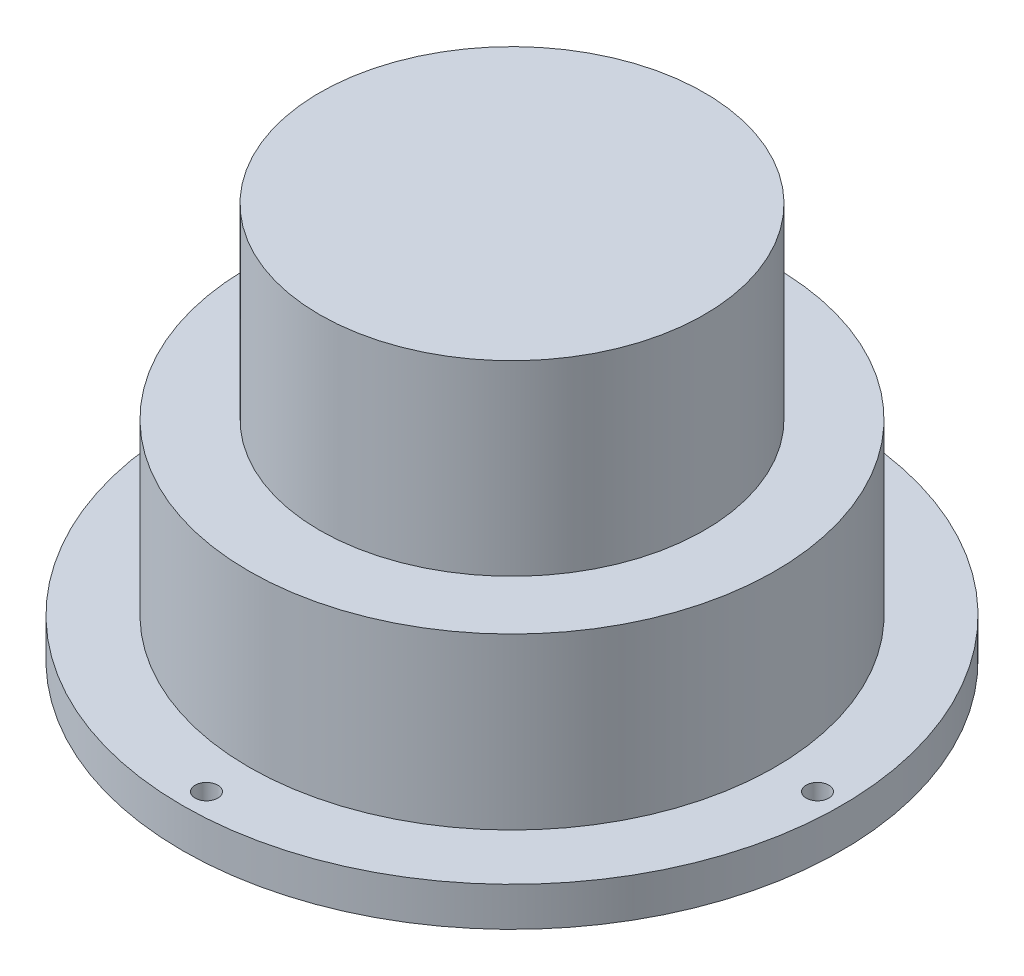
ISO-10303-21;
HEADER;
FILE_DESCRIPTION(('STEP AP214'),'2;1');
FILE_NAME('part.step','',(''),(''),'','','');
FILE_SCHEMA(('AUTOMOTIVE_DESIGN { 1 0 10303 214 1 1 1 1 }'));
ENDSEC;
DATA;
#1=APPLICATION_CONTEXT('core data for automotive mechanical design processes');
#2=APPLICATION_PROTOCOL_DEFINITION('international standard','automotive_design',2000,#1);
#3=PRODUCT_CONTEXT('',#1,'mechanical');
#4=PRODUCT('Part','Part','',(#3));
#5=PRODUCT_RELATED_PRODUCT_CATEGORY('part','',(#4));
#6=PRODUCT_DEFINITION_FORMATION('','',#4);
#7=PRODUCT_DEFINITION_CONTEXT('part definition',#1,'design');
#8=PRODUCT_DEFINITION('design','',#6,#7);
#9=PRODUCT_DEFINITION_SHAPE('','',#8);
#10=(LENGTH_UNIT() NAMED_UNIT(*) SI_UNIT(.MILLI.,.METRE.));
#11=(NAMED_UNIT(*) PLANE_ANGLE_UNIT() SI_UNIT($,.RADIAN.));
#12=(NAMED_UNIT(*) SI_UNIT($,.STERADIAN.) SOLID_ANGLE_UNIT());
#13=UNCERTAINTY_MEASURE_WITH_UNIT(LENGTH_MEASURE(1.E-05),#10,'distance_accuracy_value','');
#14=(GEOMETRIC_REPRESENTATION_CONTEXT(3) GLOBAL_UNCERTAINTY_ASSIGNED_CONTEXT((#13)) GLOBAL_UNIT_ASSIGNED_CONTEXT((#10,
#11,#12)) REPRESENTATION_CONTEXT('',''));
#15=CARTESIAN_POINT('',(0.,0.,0.));
#16=DIRECTION('',(0.,0.,1.));
#17=DIRECTION('',(1.,0.,0.));
#18=AXIS2_PLACEMENT_3D('',#15,#16,#17);
#19=CARTESIAN_POINT('',(0.,6.9,0.));
#20=DIRECTION('',(0.,-1.,0.));
#21=DIRECTION('',(0.,0.,-1.));
#22=AXIS2_PLACEMENT_3D('',#19,#20,#21);
#23=CYLINDRICAL_SURFACE('',#22,58.25);
#24=CARTESIAN_POINT('',(0.,6.9,0.));
#25=DIRECTION('',(0.,1.,0.));
#26=DIRECTION('',(0.,0.,1.));
#27=AXIS2_PLACEMENT_3D('',#24,#25,#26);
#28=CIRCLE('',#27,58.25);
#29=CARTESIAN_POINT('',(0.,6.9,-58.25));
#30=VERTEX_POINT('',#29);
#31=EDGE_CURVE('E10',#30,#30,#28,.T.);
#32=CARTESIAN_POINT('',(0.,0.,0.));
#33=DIRECTION('',(0.,1.,0.));
#34=DIRECTION('',(0.,0.,1.));
#35=AXIS2_PLACEMENT_3D('',#32,#33,#34);
#36=CIRCLE('',#35,58.25);
#37=CARTESIAN_POINT('',(0.,0.,-58.25));
#38=VERTEX_POINT('',#37);
#39=EDGE_CURVE('E34',#38,#38,#36,.T.);
#40=CARTESIAN_POINT('',(0.,6.9,-58.25));
#41=CARTESIAN_POINT('',(0.,6.828125,-58.25));
#42=CARTESIAN_POINT('',(0.,6.75625,-58.25));
#43=CARTESIAN_POINT('',(0.,6.6125,-58.25));
#44=CARTESIAN_POINT('',(0.,6.540625,-58.25));
#45=CARTESIAN_POINT('',(0.,6.396875,-58.25));
#46=CARTESIAN_POINT('',(0.,6.325,-58.25));
#47=CARTESIAN_POINT('',(0.,6.18125,-58.25));
#48=CARTESIAN_POINT('',(0.,6.109375,-58.25));
#49=CARTESIAN_POINT('',(0.,5.965625,-58.25));
#50=CARTESIAN_POINT('',(0.,5.89375,-58.25));
#51=CARTESIAN_POINT('',(0.,5.75,-58.25));
#52=CARTESIAN_POINT('',(0.,5.678125,-58.25));
#53=CARTESIAN_POINT('',(0.,5.534375,-58.25));
#54=CARTESIAN_POINT('',(0.,5.4625,-58.25));
#55=CARTESIAN_POINT('',(0.,5.31875,-58.25));
#56=CARTESIAN_POINT('',(0.,5.246875,-58.25));
#57=CARTESIAN_POINT('',(0.,5.103125,-58.25));
#58=CARTESIAN_POINT('',(0.,5.03125,-58.25));
#59=CARTESIAN_POINT('',(0.,4.8875,-58.25));
#60=CARTESIAN_POINT('',(0.,4.815625,-58.25));
#61=CARTESIAN_POINT('',(0.,4.671875,-58.25));
#62=CARTESIAN_POINT('',(0.,4.6,-58.25));
#63=CARTESIAN_POINT('',(0.,4.45625,-58.25));
#64=CARTESIAN_POINT('',(0.,4.384375,-58.25));
#65=CARTESIAN_POINT('',(0.,4.240625,-58.25));
#66=CARTESIAN_POINT('',(0.,4.16875,-58.25));
#67=CARTESIAN_POINT('',(0.,4.025,-58.25));
#68=CARTESIAN_POINT('',(0.,3.953125,-58.25));
#69=CARTESIAN_POINT('',(0.,3.809375,-58.25));
#70=CARTESIAN_POINT('',(0.,3.7375,-58.25));
#71=CARTESIAN_POINT('',(0.,3.59375,-58.25));
#72=CARTESIAN_POINT('',(0.,3.521875,-58.25));
#73=CARTESIAN_POINT('',(0.,3.378125,-58.25));
#74=CARTESIAN_POINT('',(0.,3.30625,-58.25));
#75=CARTESIAN_POINT('',(0.,3.1625,-58.25));
#76=CARTESIAN_POINT('',(0.,3.090625,-58.25));
#77=CARTESIAN_POINT('',(0.,2.946875,-58.25));
#78=CARTESIAN_POINT('',(0.,2.875,-58.25));
#79=CARTESIAN_POINT('',(0.,2.73125,-58.25));
#80=CARTESIAN_POINT('',(0.,2.659375,-58.25));
#81=CARTESIAN_POINT('',(0.,2.515625,-58.25));
#82=CARTESIAN_POINT('',(0.,2.44375,-58.25));
#83=CARTESIAN_POINT('',(0.,2.3,-58.25));
#84=CARTESIAN_POINT('',(0.,2.228125,-58.25));
#85=CARTESIAN_POINT('',(0.,2.084375,-58.25));
#86=CARTESIAN_POINT('',(0.,2.0125,-58.25));
#87=CARTESIAN_POINT('',(0.,1.86875,-58.25));
#88=CARTESIAN_POINT('',(0.,1.796875,-58.25));
#89=CARTESIAN_POINT('',(0.,1.653125,-58.25));
#90=CARTESIAN_POINT('',(0.,1.58125,-58.25));
#91=CARTESIAN_POINT('',(0.,1.4375,-58.25));
#92=CARTESIAN_POINT('',(0.,1.365625,-58.25));
#93=CARTESIAN_POINT('',(0.,1.221875,-58.25));
#94=CARTESIAN_POINT('',(0.,1.15,-58.25));
#95=CARTESIAN_POINT('',(0.,1.00625,-58.25));
#96=CARTESIAN_POINT('',(0.,0.934375,-58.25));
#97=CARTESIAN_POINT('',(0.,0.790625,-58.25));
#98=CARTESIAN_POINT('',(0.,0.71875,-58.25));
#99=CARTESIAN_POINT('',(0.,0.575,-58.25));
#100=CARTESIAN_POINT('',(0.,0.503125,-58.25));
#101=CARTESIAN_POINT('',(0.,0.359375,-58.25));
#102=CARTESIAN_POINT('',(0.,0.2875,-58.25));
#103=CARTESIAN_POINT('',(0.,0.14375,-58.25));
#104=CARTESIAN_POINT('',(0.,0.0718749999999998,-58.25));
#105=CARTESIAN_POINT('',(0.,0.,-58.25));
#106=B_SPLINE_CURVE_WITH_KNOTS('',3,(#40,#41,#42,#43,#44,#45,#46,#47,#48,#49,#50,#51,#52,#53,
#54,#55,#56,#57,#58,#59,#60,#61,#62,#63,#64,#65,#66,#67,#68,#69,#70,#71,#72,#73,#74,#75,#76,#77,
#78,#79,#80,#81,#82,#83,#84,#85,#86,#87,#88,#89,#90,#91,#92,#93,#94,#95,#96,#97,#98,#99,#100,
#101,#102,#103,#104,#105),.UNSPECIFIED.,.F.,.F.,(4,2,2,2,2,2,2,2,2,2,2,2,2,2,2,2,2,2,2,2,2,2,2,
2,2,2,2,2,2,2,2,2,4),(0.,0.215625000000001,0.43125,0.646875000000001,0.8625,1.078125,1.29375,
1.509375,1.725,1.940625,2.15625,2.371875,2.5875,2.803125,3.01875,3.234375,3.45,3.665625,3.88125,
4.096875,4.3125,4.528125,4.74375,4.959375,5.175,5.390625,5.60625,5.821875,6.0375,6.253125,
6.46875,6.684375,6.9),.UNSPECIFIED.);
#107=EDGE_CURVE('BSEAM31',#30,#38,#106,.T.);
#108=ORIENTED_EDGE('',*,*,#31,.F.);
#109=ORIENTED_EDGE('',*,*,#39,.T.);
#110=ORIENTED_EDGE('',*,*,#107,.T.);
#111=ORIENTED_EDGE('',*,*,#107,.F.);
#112=EDGE_LOOP('',(#108,#110,#109,#111));
#113=FACE_BOUND('',#112,.T.);
#114=ADVANCED_FACE('F31',(#113),#23,.T.);
#115=CARTESIAN_POINT('',(0.,6.9,0.));
#116=DIRECTION('',(0.,1.,0.));
#117=DIRECTION('',(0.,0.,1.));
#118=AXIS2_PLACEMENT_3D('',#115,#116,#117);
#119=PLANE('',#118);
#120=CARTESIAN_POINT('',(0.,6.9,0.));
#121=DIRECTION('',(0.,1.,0.));
#122=DIRECTION('',(0.,0.,1.));
#123=AXIS2_PLACEMENT_3D('',#120,#121,#122);
#124=CIRCLE('',#123,46.5);
#125=CARTESIAN_POINT('',(0.,6.9,46.5));
#126=VERTEX_POINT('',#125);
#127=EDGE_CURVE('E67',#126,#126,#124,.T.);
#128=ORIENTED_EDGE('',*,*,#127,.F.);
#129=EDGE_LOOP('',(#128));
#130=FACE_BOUND('',#129,.T.);
#131=CARTESIAN_POINT('',(0.,6.9,-54.));
#132=DIRECTION('',(0.,1.,0.));
#133=DIRECTION('',(0.,0.,1.));
#134=AXIS2_PLACEMENT_3D('',#131,#132,#133);
#135=CIRCLE('',#134,2.);
#136=CARTESIAN_POINT('',(0.,6.9,-52.));
#137=VERTEX_POINT('',#136);
#138=EDGE_CURVE('E62',#137,#137,#135,.T.);
#139=ORIENTED_EDGE('',*,*,#138,.F.);
#140=EDGE_LOOP('',(#139));
#141=FACE_BOUND('',#140,.T.);
#142=CARTESIAN_POINT('',(54.,6.9,0.));
#143=DIRECTION('',(0.,1.,0.));
#144=DIRECTION('',(0.,0.,1.));
#145=AXIS2_PLACEMENT_3D('',#142,#143,#144);
#146=CIRCLE('',#145,2.);
#147=CARTESIAN_POINT('',(54.,6.9,2.));
#148=VERTEX_POINT('',#147);
#149=EDGE_CURVE('E56',#148,#148,#146,.T.);
#150=ORIENTED_EDGE('',*,*,#149,.F.);
#151=EDGE_LOOP('',(#150));
#152=FACE_BOUND('',#151,.T.);
#153=CARTESIAN_POINT('',(0.,6.9,54.));
#154=DIRECTION('',(0.,1.,0.));
#155=DIRECTION('',(0.,0.,1.));
#156=AXIS2_PLACEMENT_3D('',#153,#154,#155);
#157=CIRCLE('',#156,2.);
#158=CARTESIAN_POINT('',(0.,6.9,56.));
#159=VERTEX_POINT('',#158);
#160=EDGE_CURVE('E49',#159,#159,#157,.T.);
#161=ORIENTED_EDGE('',*,*,#160,.F.);
#162=EDGE_LOOP('',(#161));
#163=FACE_BOUND('',#162,.T.);
#164=CARTESIAN_POINT('',(-54.,6.9,0.));
#165=DIRECTION('',(0.,1.,0.));
#166=DIRECTION('',(0.,0.,1.));
#167=AXIS2_PLACEMENT_3D('',#164,#165,#166);
#168=CIRCLE('',#167,2.);
#169=CARTESIAN_POINT('',(-54.,6.9,2.));
#170=VERTEX_POINT('',#169);
#171=EDGE_CURVE('E43',#170,#170,#168,.T.);
#172=ORIENTED_EDGE('',*,*,#171,.F.);
#173=EDGE_LOOP('',(#172));
#174=FACE_BOUND('',#173,.T.);
#175=ORIENTED_EDGE('',*,*,#31,.T.);
#176=EDGE_LOOP('',(#175));
#177=FACE_BOUND('',#176,.T.);
#178=ADVANCED_FACE('F100',(#130,#141,#152,#163,#174,#177),#119,.T.);
#179=CARTESIAN_POINT('',(0.,0.,0.));
#180=DIRECTION('',(0.,1.,0.));
#181=DIRECTION('',(0.,0.,1.));
#182=AXIS2_PLACEMENT_3D('',#179,#180,#181);
#183=PLANE('',#182);
#184=CARTESIAN_POINT('',(0.,0.,-54.));
#185=DIRECTION('',(0.,1.,0.));
#186=DIRECTION('',(0.,0.,1.));
#187=AXIS2_PLACEMENT_3D('',#184,#185,#186);
#188=CIRCLE('',#187,2.);
#189=CARTESIAN_POINT('',(0.,0.,-52.));
#190=VERTEX_POINT('',#189);
#191=EDGE_CURVE('E46',#190,#190,#188,.T.);
#192=ORIENTED_EDGE('',*,*,#191,.T.);
#193=EDGE_LOOP('',(#192));
#194=FACE_BOUND('',#193,.T.);
#195=CARTESIAN_POINT('',(54.,0.,0.));
#196=DIRECTION('',(0.,1.,0.));
#197=DIRECTION('',(0.,0.,1.));
#198=AXIS2_PLACEMENT_3D('',#195,#196,#197);
#199=CIRCLE('',#198,2.);
#200=CARTESIAN_POINT('',(54.,0.,2.));
#201=VERTEX_POINT('',#200);
#202=EDGE_CURVE('E59',#201,#201,#199,.T.);
#203=ORIENTED_EDGE('',*,*,#202,.T.);
#204=EDGE_LOOP('',(#203));
#205=FACE_BOUND('',#204,.T.);
#206=CARTESIAN_POINT('',(0.,0.,54.));
#207=DIRECTION('',(0.,1.,0.));
#208=DIRECTION('',(0.,0.,1.));
#209=AXIS2_PLACEMENT_3D('',#206,#207,#208);
#210=CIRCLE('',#209,2.);
#211=CARTESIAN_POINT('',(0.,0.,56.));
#212=VERTEX_POINT('',#211);
#213=EDGE_CURVE('E52',#212,#212,#210,.T.);
#214=ORIENTED_EDGE('',*,*,#213,.T.);
#215=EDGE_LOOP('',(#214));
#216=FACE_BOUND('',#215,.T.);
#217=CARTESIAN_POINT('',(-54.,0.,0.));
#218=DIRECTION('',(0.,1.,0.));
#219=DIRECTION('',(0.,0.,1.));
#220=AXIS2_PLACEMENT_3D('',#217,#218,#219);
#221=CIRCLE('',#220,2.);
#222=CARTESIAN_POINT('',(-54.,0.,2.));
#223=VERTEX_POINT('',#222);
#224=EDGE_CURVE('E41',#223,#223,#221,.T.);
#225=ORIENTED_EDGE('',*,*,#224,.T.);
#226=EDGE_LOOP('',(#225));
#227=FACE_BOUND('',#226,.T.);
#228=ORIENTED_EDGE('',*,*,#39,.F.);
#229=EDGE_LOOP('',(#228));
#230=FACE_BOUND('',#229,.T.);
#231=ADVANCED_FACE('F103',(#194,#205,#216,#227,#230),#183,.F.);
#232=CARTESIAN_POINT('',(-54.,0.,0.));
#233=DIRECTION('',(0.,1.,0.));
#234=DIRECTION('',(0.,0.,1.));
#235=AXIS2_PLACEMENT_3D('',#232,#233,#234);
#236=CYLINDRICAL_SURFACE('',#235,2.);
#237=CARTESIAN_POINT('',(-54.,0.,2.));
#238=CARTESIAN_POINT('',(-54.,0.071875,2.));
#239=CARTESIAN_POINT('',(-54.,0.14375,2.));
#240=CARTESIAN_POINT('',(-54.,0.2875,2.));
#241=CARTESIAN_POINT('',(-54.,0.359375,2.));
#242=CARTESIAN_POINT('',(-54.,0.503125,2.));
#243=CARTESIAN_POINT('',(-54.,0.575,2.));
#244=CARTESIAN_POINT('',(-54.,0.71875,2.));
#245=CARTESIAN_POINT('',(-54.,0.790625,2.));
#246=CARTESIAN_POINT('',(-54.,0.934375,2.));
#247=CARTESIAN_POINT('',(-54.,1.00625,2.));
#248=CARTESIAN_POINT('',(-54.,1.15,2.));
#249=CARTESIAN_POINT('',(-54.,1.221875,2.));
#250=CARTESIAN_POINT('',(-54.,1.365625,2.));
#251=CARTESIAN_POINT('',(-54.,1.4375,2.));
#252=CARTESIAN_POINT('',(-54.,1.58125,2.));
#253=CARTESIAN_POINT('',(-54.,1.653125,2.));
#254=CARTESIAN_POINT('',(-54.,1.796875,2.));
#255=CARTESIAN_POINT('',(-54.,1.86875,2.));
#256=CARTESIAN_POINT('',(-54.,2.0125,2.));
#257=CARTESIAN_POINT('',(-54.,2.084375,2.));
#258=CARTESIAN_POINT('',(-54.,2.228125,2.));
#259=CARTESIAN_POINT('',(-54.,2.3,2.));
#260=CARTESIAN_POINT('',(-54.,2.44375,2.));
#261=CARTESIAN_POINT('',(-54.,2.515625,2.));
#262=CARTESIAN_POINT('',(-54.,2.659375,2.));
#263=CARTESIAN_POINT('',(-54.,2.73125,2.));
#264=CARTESIAN_POINT('',(-54.,2.875,2.));
#265=CARTESIAN_POINT('',(-54.,2.946875,2.));
#266=CARTESIAN_POINT('',(-54.,3.090625,2.));
#267=CARTESIAN_POINT('',(-54.,3.1625,2.));
#268=CARTESIAN_POINT('',(-54.,3.30625,2.));
#269=CARTESIAN_POINT('',(-54.,3.378125,2.));
#270=CARTESIAN_POINT('',(-54.,3.521875,2.));
#271=CARTESIAN_POINT('',(-54.,3.59375,2.));
#272=CARTESIAN_POINT('',(-54.,3.7375,2.));
#273=CARTESIAN_POINT('',(-54.,3.809375,2.));
#274=CARTESIAN_POINT('',(-54.,3.953125,2.));
#275=CARTESIAN_POINT('',(-54.,4.025,2.));
#276=CARTESIAN_POINT('',(-54.,4.16875,2.));
#277=CARTESIAN_POINT('',(-54.,4.240625,2.));
#278=CARTESIAN_POINT('',(-54.,4.384375,2.));
#279=CARTESIAN_POINT('',(-54.,4.45625,2.));
#280=CARTESIAN_POINT('',(-54.,4.6,2.));
#281=CARTESIAN_POINT('',(-54.,4.671875,2.));
#282=CARTESIAN_POINT('',(-54.,4.815625,2.));
#283=CARTESIAN_POINT('',(-54.,4.8875,2.));
#284=CARTESIAN_POINT('',(-54.,5.03125,2.));
#285=CARTESIAN_POINT('',(-54.,5.103125,2.));
#286=CARTESIAN_POINT('',(-54.,5.246875,2.));
#287=CARTESIAN_POINT('',(-54.,5.31875,2.));
#288=CARTESIAN_POINT('',(-54.,5.4625,2.));
#289=CARTESIAN_POINT('',(-54.,5.534375,2.));
#290=CARTESIAN_POINT('',(-54.,5.678125,2.));
#291=CARTESIAN_POINT('',(-54.,5.75,2.));
#292=CARTESIAN_POINT('',(-54.,5.89375,2.));
#293=CARTESIAN_POINT('',(-54.,5.965625,2.));
#294=CARTESIAN_POINT('',(-54.,6.109375,2.));
#295=CARTESIAN_POINT('',(-54.,6.18125,2.));
#296=CARTESIAN_POINT('',(-54.,6.325,2.));
#297=CARTESIAN_POINT('',(-54.,6.396875,2.));
#298=CARTESIAN_POINT('',(-54.,6.540625,2.));
#299=CARTESIAN_POINT('',(-54.,6.6125,2.));
#300=CARTESIAN_POINT('',(-54.,6.75625,2.));
#301=CARTESIAN_POINT('',(-54.,6.828125,2.));
#302=CARTESIAN_POINT('',(-54.,6.9,2.));
#303=B_SPLINE_CURVE_WITH_KNOTS('',3,(#237,#238,#239,#240,#241,#242,#243,#244,#245,#246,#247,
#248,#249,#250,#251,#252,#253,#254,#255,#256,#257,#258,#259,#260,#261,#262,#263,#264,#265,#266,
#267,#268,#269,#270,#271,#272,#273,#274,#275,#276,#277,#278,#279,#280,#281,#282,#283,#284,#285,
#286,#287,#288,#289,#290,#291,#292,#293,#294,#295,#296,#297,#298,#299,#300,#301,#302),
.UNSPECIFIED.,.F.,.F.,(4,2,2,2,2,2,2,2,2,2,2,2,2,2,2,2,2,2,2,2,2,2,2,2,2,2,2,2,2,2,2,2,4),(0.,
0.215625,0.43125,0.646875,0.8625,1.078125,1.29375,1.509375,1.725,1.940625,2.15625,2.371875,
2.5875,2.803125,3.01875,3.234375,3.45,3.665625,3.88125,4.096875,4.3125,4.528125,4.74375,
4.959375,5.175,5.390625,5.60625,5.821875,6.0375,6.253125,6.46875,6.684375,6.9),.UNSPECIFIED.);
#304=EDGE_CURVE('BSEAM113',#223,#170,#303,.T.);
#305=ORIENTED_EDGE('',*,*,#224,.F.);
#306=ORIENTED_EDGE('',*,*,#171,.T.);
#307=ORIENTED_EDGE('',*,*,#304,.T.);
#308=ORIENTED_EDGE('',*,*,#304,.F.);
#309=EDGE_LOOP('',(#305,#307,#306,#308));
#310=FACE_BOUND('',#309,.T.);
#311=ADVANCED_FACE('F113',(#310),#236,.F.);
#312=CARTESIAN_POINT('',(0.,0.,54.));
#313=DIRECTION('',(0.,1.,0.));
#314=DIRECTION('',(0.,0.,1.));
#315=AXIS2_PLACEMENT_3D('',#312,#313,#314);
#316=CYLINDRICAL_SURFACE('',#315,2.);
#317=CARTESIAN_POINT('',(0.,0.,56.));
#318=CARTESIAN_POINT('',(0.,0.071875,56.));
#319=CARTESIAN_POINT('',(0.,0.14375,56.));
#320=CARTESIAN_POINT('',(0.,0.2875,56.));
#321=CARTESIAN_POINT('',(0.,0.359375,56.));
#322=CARTESIAN_POINT('',(0.,0.503125,56.));
#323=CARTESIAN_POINT('',(0.,0.575,56.));
#324=CARTESIAN_POINT('',(0.,0.71875,56.));
#325=CARTESIAN_POINT('',(0.,0.790625,56.));
#326=CARTESIAN_POINT('',(0.,0.934375,56.));
#327=CARTESIAN_POINT('',(0.,1.00625,56.));
#328=CARTESIAN_POINT('',(0.,1.15,56.));
#329=CARTESIAN_POINT('',(0.,1.221875,56.));
#330=CARTESIAN_POINT('',(0.,1.365625,56.));
#331=CARTESIAN_POINT('',(0.,1.4375,56.));
#332=CARTESIAN_POINT('',(0.,1.58125,56.));
#333=CARTESIAN_POINT('',(0.,1.653125,56.));
#334=CARTESIAN_POINT('',(0.,1.796875,56.));
#335=CARTESIAN_POINT('',(0.,1.86875,56.));
#336=CARTESIAN_POINT('',(0.,2.0125,56.));
#337=CARTESIAN_POINT('',(0.,2.084375,56.));
#338=CARTESIAN_POINT('',(0.,2.228125,56.));
#339=CARTESIAN_POINT('',(0.,2.3,56.));
#340=CARTESIAN_POINT('',(0.,2.44375,56.));
#341=CARTESIAN_POINT('',(0.,2.515625,56.));
#342=CARTESIAN_POINT('',(0.,2.659375,56.));
#343=CARTESIAN_POINT('',(0.,2.73125,56.));
#344=CARTESIAN_POINT('',(0.,2.875,56.));
#345=CARTESIAN_POINT('',(0.,2.946875,56.));
#346=CARTESIAN_POINT('',(0.,3.090625,56.));
#347=CARTESIAN_POINT('',(0.,3.1625,56.));
#348=CARTESIAN_POINT('',(0.,3.30625,56.));
#349=CARTESIAN_POINT('',(0.,3.378125,56.));
#350=CARTESIAN_POINT('',(0.,3.521875,56.));
#351=CARTESIAN_POINT('',(0.,3.59375,56.));
#352=CARTESIAN_POINT('',(0.,3.7375,56.));
#353=CARTESIAN_POINT('',(0.,3.809375,56.));
#354=CARTESIAN_POINT('',(0.,3.953125,56.));
#355=CARTESIAN_POINT('',(0.,4.025,56.));
#356=CARTESIAN_POINT('',(0.,4.16875,56.));
#357=CARTESIAN_POINT('',(0.,4.240625,56.));
#358=CARTESIAN_POINT('',(0.,4.384375,56.));
#359=CARTESIAN_POINT('',(0.,4.45625,56.));
#360=CARTESIAN_POINT('',(0.,4.6,56.));
#361=CARTESIAN_POINT('',(0.,4.671875,56.));
#362=CARTESIAN_POINT('',(0.,4.815625,56.));
#363=CARTESIAN_POINT('',(0.,4.8875,56.));
#364=CARTESIAN_POINT('',(0.,5.03125,56.));
#365=CARTESIAN_POINT('',(0.,5.103125,56.));
#366=CARTESIAN_POINT('',(0.,5.246875,56.));
#367=CARTESIAN_POINT('',(0.,5.31875,56.));
#368=CARTESIAN_POINT('',(0.,5.4625,56.));
#369=CARTESIAN_POINT('',(0.,5.534375,56.));
#370=CARTESIAN_POINT('',(0.,5.678125,56.));
#371=CARTESIAN_POINT('',(0.,5.75,56.));
#372=CARTESIAN_POINT('',(0.,5.89375,56.));
#373=CARTESIAN_POINT('',(0.,5.965625,56.));
#374=CARTESIAN_POINT('',(0.,6.109375,56.));
#375=CARTESIAN_POINT('',(0.,6.18125,56.));
#376=CARTESIAN_POINT('',(0.,6.325,56.));
#377=CARTESIAN_POINT('',(0.,6.396875,56.));
#378=CARTESIAN_POINT('',(0.,6.540625,56.));
#379=CARTESIAN_POINT('',(0.,6.6125,56.));
#380=CARTESIAN_POINT('',(0.,6.75625,56.));
#381=CARTESIAN_POINT('',(0.,6.828125,56.));
#382=CARTESIAN_POINT('',(0.,6.9,56.));
#383=B_SPLINE_CURVE_WITH_KNOTS('',3,(#317,#318,#319,#320,#321,#322,#323,#324,#325,#326,#327,
#328,#329,#330,#331,#332,#333,#334,#335,#336,#337,#338,#339,#340,#341,#342,#343,#344,#345,#346,
#347,#348,#349,#350,#351,#352,#353,#354,#355,#356,#357,#358,#359,#360,#361,#362,#363,#364,#365,
#366,#367,#368,#369,#370,#371,#372,#373,#374,#375,#376,#377,#378,#379,#380,#381,#382),
.UNSPECIFIED.,.F.,.F.,(4,2,2,2,2,2,2,2,2,2,2,2,2,2,2,2,2,2,2,2,2,2,2,2,2,2,2,2,2,2,2,2,4),(0.,
0.215625,0.43125,0.646875,0.8625,1.078125,1.29375,1.509375,1.725,1.940625,2.15625,2.371875,
2.5875,2.803125,3.01875,3.234375,3.45,3.665625,3.88125,4.096875,4.3125,4.528125,4.74375,
4.959375,5.175,5.390625,5.60625,5.821875,6.0375,6.253125,6.46875,6.684375,6.9),.UNSPECIFIED.);
#384=EDGE_CURVE('BSEAM115',#212,#159,#383,.T.);
#385=ORIENTED_EDGE('',*,*,#213,.F.);
#386=ORIENTED_EDGE('',*,*,#160,.T.);
#387=ORIENTED_EDGE('',*,*,#384,.T.);
#388=ORIENTED_EDGE('',*,*,#384,.F.);
#389=EDGE_LOOP('',(#385,#387,#386,#388));
#390=FACE_BOUND('',#389,.T.);
#391=ADVANCED_FACE('F115',(#390),#316,.F.);
#392=CARTESIAN_POINT('',(54.,0.,0.));
#393=DIRECTION('',(0.,1.,0.));
#394=DIRECTION('',(0.,0.,1.));
#395=AXIS2_PLACEMENT_3D('',#392,#393,#394);
#396=CYLINDRICAL_SURFACE('',#395,2.);
#397=CARTESIAN_POINT('',(54.,0.,2.));
#398=CARTESIAN_POINT('',(54.,0.071875,2.));
#399=CARTESIAN_POINT('',(54.,0.14375,2.));
#400=CARTESIAN_POINT('',(54.,0.2875,2.));
#401=CARTESIAN_POINT('',(54.,0.359375,2.));
#402=CARTESIAN_POINT('',(54.,0.503125,2.));
#403=CARTESIAN_POINT('',(54.,0.575,2.));
#404=CARTESIAN_POINT('',(54.,0.71875,2.));
#405=CARTESIAN_POINT('',(54.,0.790625,2.));
#406=CARTESIAN_POINT('',(54.,0.934375,2.));
#407=CARTESIAN_POINT('',(54.,1.00625,2.));
#408=CARTESIAN_POINT('',(54.,1.15,2.));
#409=CARTESIAN_POINT('',(54.,1.221875,2.));
#410=CARTESIAN_POINT('',(54.,1.365625,2.));
#411=CARTESIAN_POINT('',(54.,1.4375,2.));
#412=CARTESIAN_POINT('',(54.,1.58125,2.));
#413=CARTESIAN_POINT('',(54.,1.653125,2.));
#414=CARTESIAN_POINT('',(54.,1.796875,2.));
#415=CARTESIAN_POINT('',(54.,1.86875,2.));
#416=CARTESIAN_POINT('',(54.,2.0125,2.));
#417=CARTESIAN_POINT('',(54.,2.084375,2.));
#418=CARTESIAN_POINT('',(54.,2.228125,2.));
#419=CARTESIAN_POINT('',(54.,2.3,2.));
#420=CARTESIAN_POINT('',(54.,2.44375,2.));
#421=CARTESIAN_POINT('',(54.,2.515625,2.));
#422=CARTESIAN_POINT('',(54.,2.659375,2.));
#423=CARTESIAN_POINT('',(54.,2.73125,2.));
#424=CARTESIAN_POINT('',(54.,2.875,2.));
#425=CARTESIAN_POINT('',(54.,2.946875,2.));
#426=CARTESIAN_POINT('',(54.,3.090625,2.));
#427=CARTESIAN_POINT('',(54.,3.1625,2.));
#428=CARTESIAN_POINT('',(54.,3.30625,2.));
#429=CARTESIAN_POINT('',(54.,3.378125,2.));
#430=CARTESIAN_POINT('',(54.,3.521875,2.));
#431=CARTESIAN_POINT('',(54.,3.59375,2.));
#432=CARTESIAN_POINT('',(54.,3.7375,2.));
#433=CARTESIAN_POINT('',(54.,3.809375,2.));
#434=CARTESIAN_POINT('',(54.,3.953125,2.));
#435=CARTESIAN_POINT('',(54.,4.025,2.));
#436=CARTESIAN_POINT('',(54.,4.16875,2.));
#437=CARTESIAN_POINT('',(54.,4.240625,2.));
#438=CARTESIAN_POINT('',(54.,4.384375,2.));
#439=CARTESIAN_POINT('',(54.,4.45625,2.));
#440=CARTESIAN_POINT('',(54.,4.6,2.));
#441=CARTESIAN_POINT('',(54.,4.671875,2.));
#442=CARTESIAN_POINT('',(54.,4.815625,2.));
#443=CARTESIAN_POINT('',(54.,4.8875,2.));
#444=CARTESIAN_POINT('',(54.,5.03125,2.));
#445=CARTESIAN_POINT('',(54.,5.103125,2.));
#446=CARTESIAN_POINT('',(54.,5.246875,2.));
#447=CARTESIAN_POINT('',(54.,5.31875,2.));
#448=CARTESIAN_POINT('',(54.,5.4625,2.));
#449=CARTESIAN_POINT('',(54.,5.534375,2.));
#450=CARTESIAN_POINT('',(54.,5.678125,2.));
#451=CARTESIAN_POINT('',(54.,5.75,2.));
#452=CARTESIAN_POINT('',(54.,5.89375,2.));
#453=CARTESIAN_POINT('',(54.,5.965625,2.));
#454=CARTESIAN_POINT('',(54.,6.109375,2.));
#455=CARTESIAN_POINT('',(54.,6.18125,2.));
#456=CARTESIAN_POINT('',(54.,6.325,2.));
#457=CARTESIAN_POINT('',(54.,6.396875,2.));
#458=CARTESIAN_POINT('',(54.,6.540625,2.));
#459=CARTESIAN_POINT('',(54.,6.6125,2.));
#460=CARTESIAN_POINT('',(54.,6.75625,2.));
#461=CARTESIAN_POINT('',(54.,6.828125,2.));
#462=CARTESIAN_POINT('',(54.,6.9,2.));
#463=B_SPLINE_CURVE_WITH_KNOTS('',3,(#397,#398,#399,#400,#401,#402,#403,#404,#405,#406,#407,
#408,#409,#410,#411,#412,#413,#414,#415,#416,#417,#418,#419,#420,#421,#422,#423,#424,#425,#426,
#427,#428,#429,#430,#431,#432,#433,#434,#435,#436,#437,#438,#439,#440,#441,#442,#443,#444,#445,
#446,#447,#448,#449,#450,#451,#452,#453,#454,#455,#456,#457,#458,#459,#460,#461,#462),
.UNSPECIFIED.,.F.,.F.,(4,2,2,2,2,2,2,2,2,2,2,2,2,2,2,2,2,2,2,2,2,2,2,2,2,2,2,2,2,2,2,2,4),(0.,
0.215625,0.43125,0.646875,0.8625,1.078125,1.29375,1.509375,1.725,1.940625,2.15625,2.371875,
2.5875,2.803125,3.01875,3.234375,3.45,3.665625,3.88125,4.096875,4.3125,4.528125,4.74375,
4.959375,5.175,5.390625,5.60625,5.821875,6.0375,6.253125,6.46875,6.684375,6.9),.UNSPECIFIED.);
#464=EDGE_CURVE('BSEAM122',#201,#148,#463,.T.);
#465=ORIENTED_EDGE('',*,*,#202,.F.);
#466=ORIENTED_EDGE('',*,*,#149,.T.);
#467=ORIENTED_EDGE('',*,*,#464,.T.);
#468=ORIENTED_EDGE('',*,*,#464,.F.);
#469=EDGE_LOOP('',(#465,#467,#466,#468));
#470=FACE_BOUND('',#469,.T.);
#471=ADVANCED_FACE('F122',(#470),#396,.F.);
#472=CARTESIAN_POINT('',(0.,0.,-54.));
#473=DIRECTION('',(0.,1.,0.));
#474=DIRECTION('',(0.,0.,1.));
#475=AXIS2_PLACEMENT_3D('',#472,#473,#474);
#476=CYLINDRICAL_SURFACE('',#475,2.);
#477=CARTESIAN_POINT('',(0.,0.,-52.));
#478=CARTESIAN_POINT('',(0.,0.071875,-52.));
#479=CARTESIAN_POINT('',(0.,0.14375,-52.));
#480=CARTESIAN_POINT('',(0.,0.2875,-52.));
#481=CARTESIAN_POINT('',(0.,0.359375,-52.));
#482=CARTESIAN_POINT('',(0.,0.503125,-52.));
#483=CARTESIAN_POINT('',(0.,0.575,-52.));
#484=CARTESIAN_POINT('',(0.,0.71875,-52.));
#485=CARTESIAN_POINT('',(0.,0.790625,-52.));
#486=CARTESIAN_POINT('',(0.,0.934375,-52.));
#487=CARTESIAN_POINT('',(0.,1.00625,-52.));
#488=CARTESIAN_POINT('',(0.,1.15,-52.));
#489=CARTESIAN_POINT('',(0.,1.221875,-52.));
#490=CARTESIAN_POINT('',(0.,1.365625,-52.));
#491=CARTESIAN_POINT('',(0.,1.4375,-52.));
#492=CARTESIAN_POINT('',(0.,1.58125,-52.));
#493=CARTESIAN_POINT('',(0.,1.653125,-52.));
#494=CARTESIAN_POINT('',(0.,1.796875,-52.));
#495=CARTESIAN_POINT('',(0.,1.86875,-52.));
#496=CARTESIAN_POINT('',(0.,2.0125,-52.));
#497=CARTESIAN_POINT('',(0.,2.084375,-52.));
#498=CARTESIAN_POINT('',(0.,2.228125,-52.));
#499=CARTESIAN_POINT('',(0.,2.3,-52.));
#500=CARTESIAN_POINT('',(0.,2.44375,-52.));
#501=CARTESIAN_POINT('',(0.,2.515625,-52.));
#502=CARTESIAN_POINT('',(0.,2.659375,-52.));
#503=CARTESIAN_POINT('',(0.,2.73125,-52.));
#504=CARTESIAN_POINT('',(0.,2.875,-52.));
#505=CARTESIAN_POINT('',(0.,2.946875,-52.));
#506=CARTESIAN_POINT('',(0.,3.090625,-52.));
#507=CARTESIAN_POINT('',(0.,3.1625,-52.));
#508=CARTESIAN_POINT('',(0.,3.30625,-52.));
#509=CARTESIAN_POINT('',(0.,3.378125,-52.));
#510=CARTESIAN_POINT('',(0.,3.521875,-52.));
#511=CARTESIAN_POINT('',(0.,3.59375,-52.));
#512=CARTESIAN_POINT('',(0.,3.7375,-52.));
#513=CARTESIAN_POINT('',(0.,3.809375,-52.));
#514=CARTESIAN_POINT('',(0.,3.953125,-52.));
#515=CARTESIAN_POINT('',(0.,4.025,-52.));
#516=CARTESIAN_POINT('',(0.,4.16875,-52.));
#517=CARTESIAN_POINT('',(0.,4.240625,-52.));
#518=CARTESIAN_POINT('',(0.,4.384375,-52.));
#519=CARTESIAN_POINT('',(0.,4.45625,-52.));
#520=CARTESIAN_POINT('',(0.,4.6,-52.));
#521=CARTESIAN_POINT('',(0.,4.671875,-52.));
#522=CARTESIAN_POINT('',(0.,4.815625,-52.));
#523=CARTESIAN_POINT('',(0.,4.8875,-52.));
#524=CARTESIAN_POINT('',(0.,5.03125,-52.));
#525=CARTESIAN_POINT('',(0.,5.103125,-52.));
#526=CARTESIAN_POINT('',(0.,5.246875,-52.));
#527=CARTESIAN_POINT('',(0.,5.31875,-52.));
#528=CARTESIAN_POINT('',(0.,5.4625,-52.));
#529=CARTESIAN_POINT('',(0.,5.534375,-52.));
#530=CARTESIAN_POINT('',(0.,5.678125,-52.));
#531=CARTESIAN_POINT('',(0.,5.75,-52.));
#532=CARTESIAN_POINT('',(0.,5.89375,-52.));
#533=CARTESIAN_POINT('',(0.,5.965625,-52.));
#534=CARTESIAN_POINT('',(0.,6.109375,-52.));
#535=CARTESIAN_POINT('',(0.,6.18125,-52.));
#536=CARTESIAN_POINT('',(0.,6.325,-52.));
#537=CARTESIAN_POINT('',(0.,6.396875,-52.));
#538=CARTESIAN_POINT('',(0.,6.540625,-52.));
#539=CARTESIAN_POINT('',(0.,6.6125,-52.));
#540=CARTESIAN_POINT('',(0.,6.75625,-52.));
#541=CARTESIAN_POINT('',(0.,6.828125,-52.));
#542=CARTESIAN_POINT('',(0.,6.9,-52.));
#543=B_SPLINE_CURVE_WITH_KNOTS('',3,(#477,#478,#479,#480,#481,#482,#483,#484,#485,#486,#487,
#488,#489,#490,#491,#492,#493,#494,#495,#496,#497,#498,#499,#500,#501,#502,#503,#504,#505,#506,
#507,#508,#509,#510,#511,#512,#513,#514,#515,#516,#517,#518,#519,#520,#521,#522,#523,#524,#525,
#526,#527,#528,#529,#530,#531,#532,#533,#534,#535,#536,#537,#538,#539,#540,#541,#542),
.UNSPECIFIED.,.F.,.F.,(4,2,2,2,2,2,2,2,2,2,2,2,2,2,2,2,2,2,2,2,2,2,2,2,2,2,2,2,2,2,2,2,4),(0.,
0.215625,0.43125,0.646875,0.8625,1.078125,1.29375,1.509375,1.725,1.940625,2.15625,2.371875,
2.5875,2.803125,3.01875,3.234375,3.45,3.665625,3.88125,4.096875,4.3125,4.528125,4.74375,
4.959375,5.175,5.390625,5.60625,5.821875,6.0375,6.253125,6.46875,6.684375,6.9),.UNSPECIFIED.);
#544=EDGE_CURVE('BSEAM96',#190,#137,#543,.T.);
#545=ORIENTED_EDGE('',*,*,#191,.F.);
#546=ORIENTED_EDGE('',*,*,#138,.T.);
#547=ORIENTED_EDGE('',*,*,#544,.T.);
#548=ORIENTED_EDGE('',*,*,#544,.F.);
#549=EDGE_LOOP('',(#545,#547,#546,#548));
#550=FACE_BOUND('',#549,.T.);
#551=ADVANCED_FACE('F96',(#550),#476,.F.);
#552=CARTESIAN_POINT('',(0.,36.9,0.));
#553=DIRECTION('',(0.,-1.,0.));
#554=DIRECTION('',(0.,0.,-1.));
#555=AXIS2_PLACEMENT_3D('',#552,#553,#554);
#556=CYLINDRICAL_SURFACE('',#555,46.5);
#557=CARTESIAN_POINT('',(0.,36.9,0.));
#558=DIRECTION('',(0.,1.,0.));
#559=DIRECTION('',(0.,0.,1.));
#560=AXIS2_PLACEMENT_3D('',#557,#558,#559);
#561=CIRCLE('',#560,46.5);
#562=CARTESIAN_POINT('',(0.,36.9,46.5));
#563=VERTEX_POINT('',#562);
#564=EDGE_CURVE('E53',#563,#563,#561,.T.);
#565=ORIENTED_EDGE('',*,*,#564,.F.);
#566=EDGE_LOOP('',(#565));
#567=FACE_BOUND('',#566,.T.);
#568=ORIENTED_EDGE('',*,*,#127,.T.);
#569=EDGE_LOOP('',(#568));
#570=FACE_BOUND('',#569,.T.);
#571=ADVANCED_FACE('F90',(#567,#570),#556,.T.);
#572=CARTESIAN_POINT('',(0.,36.9,0.));
#573=DIRECTION('',(0.,1.,0.));
#574=DIRECTION('',(0.,0.,1.));
#575=AXIS2_PLACEMENT_3D('',#572,#573,#574);
#576=PLANE('',#575);
#577=CARTESIAN_POINT('',(0.,36.9,0.));
#578=DIRECTION('',(0.,1.,0.));
#579=DIRECTION('',(0.,0.,1.));
#580=AXIS2_PLACEMENT_3D('',#577,#578,#579);
#581=CIRCLE('',#580,34.);
#582=CARTESIAN_POINT('',(0.,36.9,34.));
#583=VERTEX_POINT('',#582);
#584=EDGE_CURVE('E73',#583,#583,#581,.T.);
#585=ORIENTED_EDGE('',*,*,#584,.F.);
#586=EDGE_LOOP('',(#585));
#587=FACE_BOUND('',#586,.T.);
#588=ORIENTED_EDGE('',*,*,#564,.T.);
#589=EDGE_LOOP('',(#588));
#590=FACE_BOUND('',#589,.T.);
#591=ADVANCED_FACE('F84',(#587,#590),#576,.T.);
#592=CARTESIAN_POINT('',(0.,69.9,0.));
#593=DIRECTION('',(0.,-1.,0.));
#594=DIRECTION('',(0.,0.,-1.));
#595=AXIS2_PLACEMENT_3D('',#592,#593,#594);
#596=CYLINDRICAL_SURFACE('',#595,34.);
#597=CARTESIAN_POINT('',(0.,69.9,0.));
#598=DIRECTION('',(0.,1.,0.));
#599=DIRECTION('',(0.,0.,1.));
#600=AXIS2_PLACEMENT_3D('',#597,#598,#599);
#601=CIRCLE('',#600,34.);
#602=CARTESIAN_POINT('',(0.,69.9,34.));
#603=VERTEX_POINT('',#602);
#604=EDGE_CURVE('E70',#603,#603,#601,.T.);
#605=ORIENTED_EDGE('',*,*,#604,.F.);
#606=EDGE_LOOP('',(#605));
#607=FACE_BOUND('',#606,.T.);
#608=ORIENTED_EDGE('',*,*,#584,.T.);
#609=EDGE_LOOP('',(#608));
#610=FACE_BOUND('',#609,.T.);
#611=ADVANCED_FACE('F81',(#607,#610),#596,.T.);
#612=CARTESIAN_POINT('',(0.,69.9,0.));
#613=DIRECTION('',(0.,1.,0.));
#614=DIRECTION('',(0.,0.,1.));
#615=AXIS2_PLACEMENT_3D('',#612,#613,#614);
#616=PLANE('',#615);
#617=ORIENTED_EDGE('',*,*,#604,.T.);
#618=EDGE_LOOP('',(#617));
#619=FACE_BOUND('',#618,.T.);
#620=ADVANCED_FACE('F79',(#619),#616,.T.);
#621=CLOSED_SHELL('',(#114,#178,#231,#311,#391,#471,#551,#571,#591,#611,#620));
#622=MANIFOLD_SOLID_BREP('B2',#621);
#623=ADVANCED_BREP_SHAPE_REPRESENTATION('',(#18,#622),#14);
#624=SHAPE_DEFINITION_REPRESENTATION(#9,#623);
ENDSEC;
END-ISO-10303-21;
